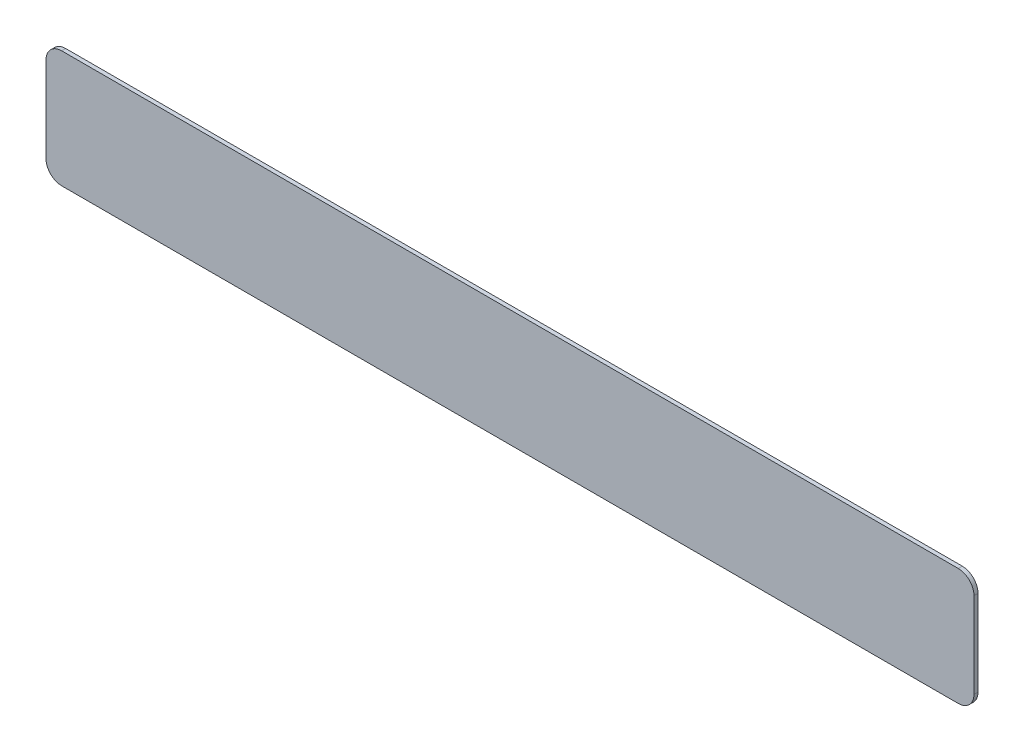
ISO-10303-21;
HEADER;
FILE_DESCRIPTION(('STEP AP214'),'2;1');
FILE_NAME('part.step','',(''),(''),'','','');
FILE_SCHEMA(('AUTOMOTIVE_DESIGN { 1 0 10303 214 1 1 1 1 }'));
ENDSEC;
DATA;
#1=APPLICATION_CONTEXT('core data for automotive mechanical design processes');
#2=APPLICATION_PROTOCOL_DEFINITION('international standard','automotive_design',2000,#1);
#3=PRODUCT_CONTEXT('',#1,'mechanical');
#4=PRODUCT('Part','Part','',(#3));
#5=PRODUCT_RELATED_PRODUCT_CATEGORY('part','',(#4));
#6=PRODUCT_DEFINITION_FORMATION('','',#4);
#7=PRODUCT_DEFINITION_CONTEXT('part definition',#1,'design');
#8=PRODUCT_DEFINITION('design','',#6,#7);
#9=PRODUCT_DEFINITION_SHAPE('','',#8);
#10=(LENGTH_UNIT() NAMED_UNIT(*) SI_UNIT(.MILLI.,.METRE.));
#11=(NAMED_UNIT(*) PLANE_ANGLE_UNIT() SI_UNIT($,.RADIAN.));
#12=(NAMED_UNIT(*) SI_UNIT($,.STERADIAN.) SOLID_ANGLE_UNIT());
#13=UNCERTAINTY_MEASURE_WITH_UNIT(LENGTH_MEASURE(1.E-05),#10,'distance_accuracy_value','');
#14=(GEOMETRIC_REPRESENTATION_CONTEXT(3) GLOBAL_UNCERTAINTY_ASSIGNED_CONTEXT((#13)) GLOBAL_UNIT_ASSIGNED_CONTEXT((#10,
#11,#12)) REPRESENTATION_CONTEXT('',''));
#15=CARTESIAN_POINT('',(0.,0.,0.));
#16=DIRECTION('',(0.,0.,1.));
#17=DIRECTION('',(1.,0.,0.));
#18=AXIS2_PLACEMENT_3D('',#15,#16,#17);
#19=CARTESIAN_POINT('',(-35.65,-3.4,0.32));
#20=DIRECTION('',(0.,0.,-1.));
#21=DIRECTION('',(-1.,0.,0.));
#22=AXIS2_PLACEMENT_3D('',#19,#20,#21);
#23=CYLINDRICAL_SURFACE('',#22,1.25);
#24=CARTESIAN_POINT('',(-35.65,-3.4,0.));
#25=DIRECTION('',(0.,0.,1.));
#26=DIRECTION('',(1.,0.,0.));
#27=AXIS2_PLACEMENT_3D('',#24,#25,#26);
#28=CIRCLE('',#27,1.25);
#29=CARTESIAN_POINT('',(-36.9,-3.4,0.));
#30=VERTEX_POINT('',#29);
#31=CARTESIAN_POINT('',(-35.65,-4.65,0.));
#32=VERTEX_POINT('',#31);
#33=EDGE_CURVE('E128',#30,#32,#28,.T.);
#34=ORIENTED_EDGE('',*,*,#33,.T.);
#35=DIRECTION('',(0.,0.,-1.));
#36=VECTOR('',#35,1.);
#37=CARTESIAN_POINT('',(-35.65,-4.65,0.32));
#38=LINE('',#37,#36);
#39=CARTESIAN_POINT('',(-35.65,-4.65,0.32));
#40=VERTEX_POINT('',#39);
#41=EDGE_CURVE('E11',#40,#32,#38,.T.);
#42=ORIENTED_EDGE('',*,*,#41,.F.);
#43=CARTESIAN_POINT('',(-35.65,-3.4,0.32));
#44=DIRECTION('',(0.,0.,1.));
#45=DIRECTION('',(1.,0.,0.));
#46=AXIS2_PLACEMENT_3D('',#43,#44,#45);
#47=CIRCLE('',#46,1.25);
#48=CARTESIAN_POINT('',(-36.9,-3.4,0.32));
#49=VERTEX_POINT('',#48);
#50=EDGE_CURVE('E142',#49,#40,#47,.T.);
#51=ORIENTED_EDGE('',*,*,#50,.F.);
#52=DIRECTION('',(0.,0.,-1.));
#53=VECTOR('',#52,1.);
#54=CARTESIAN_POINT('',(-36.9,-3.4,0.32));
#55=LINE('',#54,#53);
#56=EDGE_CURVE('E124',#49,#30,#55,.T.);
#57=ORIENTED_EDGE('',*,*,#56,.T.);
#58=EDGE_LOOP('',(#34,#42,#51,#57));
#59=FACE_BOUND('',#58,.T.);
#60=ADVANCED_FACE('F32',(#59),#23,.T.);
#61=CARTESIAN_POINT('',(-35.65,-4.65,0.32));
#62=DIRECTION('',(0.,1.,0.));
#63=DIRECTION('',(-1.,0.,0.));
#64=AXIS2_PLACEMENT_3D('',#61,#62,#63);
#65=PLANE('',#64);
#66=DIRECTION('',(1.,0.,0.));
#67=VECTOR('',#66,1.);
#68=CARTESIAN_POINT('',(-35.65,-4.65,0.));
#69=LINE('',#68,#67);
#70=CARTESIAN_POINT('',(35.65,-4.65,0.));
#71=VERTEX_POINT('',#70);
#72=EDGE_CURVE('E131',#32,#71,#69,.T.);
#73=ORIENTED_EDGE('',*,*,#72,.T.);
#74=DIRECTION('',(0.,0.,-1.));
#75=VECTOR('',#74,1.);
#76=CARTESIAN_POINT('',(35.65,-4.65,0.32));
#77=LINE('',#76,#75);
#78=CARTESIAN_POINT('',(35.65,-4.65,0.32));
#79=VERTEX_POINT('',#78);
#80=EDGE_CURVE('E40',#79,#71,#77,.T.);
#81=ORIENTED_EDGE('',*,*,#80,.F.);
#82=DIRECTION('',(1.,0.,0.));
#83=VECTOR('',#82,1.);
#84=CARTESIAN_POINT('',(-35.65,-4.65,0.32));
#85=LINE('',#84,#83);
#86=EDGE_CURVE('E91',#40,#79,#85,.T.);
#87=ORIENTED_EDGE('',*,*,#86,.F.);
#88=ORIENTED_EDGE('',*,*,#41,.T.);
#89=EDGE_LOOP('',(#73,#81,#87,#88));
#90=FACE_BOUND('',#89,.T.);
#91=ADVANCED_FACE('F177',(#90),#65,.F.);
#92=CARTESIAN_POINT('',(35.65,-3.4,0.32));
#93=DIRECTION('',(0.,0.,-1.));
#94=DIRECTION('',(-1.,0.,0.));
#95=AXIS2_PLACEMENT_3D('',#92,#93,#94);
#96=CYLINDRICAL_SURFACE('',#95,1.25);
#97=CARTESIAN_POINT('',(35.65,-3.4,0.));
#98=DIRECTION('',(0.,0.,1.));
#99=DIRECTION('',(1.,0.,0.));
#100=AXIS2_PLACEMENT_3D('',#97,#98,#99);
#101=CIRCLE('',#100,1.25);
#102=CARTESIAN_POINT('',(36.9,-3.4,0.));
#103=VERTEX_POINT('',#102);
#104=EDGE_CURVE('E133',#71,#103,#101,.T.);
#105=ORIENTED_EDGE('',*,*,#104,.T.);
#106=DIRECTION('',(0.,0.,-1.));
#107=VECTOR('',#106,1.);
#108=CARTESIAN_POINT('',(36.9,-3.4,0.32));
#109=LINE('',#108,#107);
#110=CARTESIAN_POINT('',(36.9,-3.4,0.32));
#111=VERTEX_POINT('',#110);
#112=EDGE_CURVE('E149',#111,#103,#109,.T.);
#113=ORIENTED_EDGE('',*,*,#112,.F.);
#114=CARTESIAN_POINT('',(35.65,-3.4,0.32));
#115=DIRECTION('',(0.,0.,1.));
#116=DIRECTION('',(1.,0.,0.));
#117=AXIS2_PLACEMENT_3D('',#114,#115,#116);
#118=CIRCLE('',#117,1.25);
#119=EDGE_CURVE('E157',#79,#111,#118,.T.);
#120=ORIENTED_EDGE('',*,*,#119,.F.);
#121=ORIENTED_EDGE('',*,*,#80,.T.);
#122=EDGE_LOOP('',(#105,#113,#120,#121));
#123=FACE_BOUND('',#122,.T.);
#124=ADVANCED_FACE('F155',(#123),#96,.T.);
#125=CARTESIAN_POINT('',(36.9,3.4,0.32));
#126=DIRECTION('',(-1.,0.,0.));
#127=DIRECTION('',(0.,-1.,0.));
#128=AXIS2_PLACEMENT_3D('',#125,#126,#127);
#129=PLANE('',#128);
#130=DIRECTION('',(0.,1.,0.));
#131=VECTOR('',#130,1.);
#132=CARTESIAN_POINT('',(36.9,3.4,0.));
#133=LINE('',#132,#131);
#134=CARTESIAN_POINT('',(36.9,3.4,0.));
#135=VERTEX_POINT('',#134);
#136=EDGE_CURVE('E135',#103,#135,#133,.T.);
#137=ORIENTED_EDGE('',*,*,#136,.T.);
#138=DIRECTION('',(0.,0.,-1.));
#139=VECTOR('',#138,1.);
#140=CARTESIAN_POINT('',(36.9,3.4,0.32));
#141=LINE('',#140,#139);
#142=CARTESIAN_POINT('',(36.9,3.4,0.32));
#143=VERTEX_POINT('',#142);
#144=EDGE_CURVE('E146',#143,#135,#141,.T.);
#145=ORIENTED_EDGE('',*,*,#144,.F.);
#146=DIRECTION('',(0.,1.,0.));
#147=VECTOR('',#146,1.);
#148=CARTESIAN_POINT('',(36.9,3.4,0.32));
#149=LINE('',#148,#147);
#150=EDGE_CURVE('E169',#111,#143,#149,.T.);
#151=ORIENTED_EDGE('',*,*,#150,.F.);
#152=ORIENTED_EDGE('',*,*,#112,.T.);
#153=EDGE_LOOP('',(#137,#145,#151,#152));
#154=FACE_BOUND('',#153,.T.);
#155=ADVANCED_FACE('F165',(#154),#129,.F.);
#156=CARTESIAN_POINT('',(35.65,3.4,0.32));
#157=DIRECTION('',(0.,0.,-1.));
#158=DIRECTION('',(-1.,0.,0.));
#159=AXIS2_PLACEMENT_3D('',#156,#157,#158);
#160=CYLINDRICAL_SURFACE('',#159,1.24999999999999);
#161=CARTESIAN_POINT('',(35.65,3.4,0.));
#162=DIRECTION('',(0.,0.,1.));
#163=DIRECTION('',(-1.,0.,0.));
#164=AXIS2_PLACEMENT_3D('',#161,#162,#163);
#165=CIRCLE('',#164,1.24999999999999);
#166=CARTESIAN_POINT('',(35.65,4.65,0.));
#167=VERTEX_POINT('',#166);
#168=EDGE_CURVE('E137',#135,#167,#165,.T.);
#169=ORIENTED_EDGE('',*,*,#168,.T.);
#170=DIRECTION('',(0.,0.,-1.));
#171=VECTOR('',#170,1.);
#172=CARTESIAN_POINT('',(35.65,4.65,0.32));
#173=LINE('',#172,#171);
#174=CARTESIAN_POINT('',(35.65,4.65,0.32));
#175=VERTEX_POINT('',#174);
#176=EDGE_CURVE('E119',#175,#167,#173,.T.);
#177=ORIENTED_EDGE('',*,*,#176,.F.);
#178=CARTESIAN_POINT('',(35.65,3.4,0.32));
#179=DIRECTION('',(0.,0.,1.));
#180=DIRECTION('',(-1.,0.,0.));
#181=AXIS2_PLACEMENT_3D('',#178,#179,#180);
#182=CIRCLE('',#181,1.24999999999999);
#183=EDGE_CURVE('E110',#143,#175,#182,.T.);
#184=ORIENTED_EDGE('',*,*,#183,.F.);
#185=ORIENTED_EDGE('',*,*,#144,.T.);
#186=EDGE_LOOP('',(#169,#177,#184,#185));
#187=FACE_BOUND('',#186,.T.);
#188=ADVANCED_FACE('F168',(#187),#160,.T.);
#189=CARTESIAN_POINT('',(-35.65,4.65,0.32));
#190=DIRECTION('',(0.,-1.,0.));
#191=DIRECTION('',(1.,0.,0.));
#192=AXIS2_PLACEMENT_3D('',#189,#190,#191);
#193=PLANE('',#192);
#194=DIRECTION('',(-1.,0.,0.));
#195=VECTOR('',#194,1.);
#196=CARTESIAN_POINT('',(-35.65,4.65,0.));
#197=LINE('',#196,#195);
#198=CARTESIAN_POINT('',(-35.65,4.65,0.));
#199=VERTEX_POINT('',#198);
#200=EDGE_CURVE('E118',#167,#199,#197,.T.);
#201=ORIENTED_EDGE('',*,*,#200,.T.);
#202=DIRECTION('',(0.,0.,-1.));
#203=VECTOR('',#202,1.);
#204=CARTESIAN_POINT('',(-35.65,4.65,0.32));
#205=LINE('',#204,#203);
#206=CARTESIAN_POINT('',(-35.65,4.65,0.32));
#207=VERTEX_POINT('',#206);
#208=EDGE_CURVE('E115',#207,#199,#205,.T.);
#209=ORIENTED_EDGE('',*,*,#208,.F.);
#210=DIRECTION('',(-1.,0.,0.));
#211=VECTOR('',#210,1.);
#212=CARTESIAN_POINT('',(-35.65,4.65,0.32));
#213=LINE('',#212,#211);
#214=EDGE_CURVE('E104',#175,#207,#213,.T.);
#215=ORIENTED_EDGE('',*,*,#214,.F.);
#216=ORIENTED_EDGE('',*,*,#176,.T.);
#217=EDGE_LOOP('',(#201,#209,#215,#216));
#218=FACE_BOUND('',#217,.T.);
#219=ADVANCED_FACE('F116',(#218),#193,.F.);
#220=CARTESIAN_POINT('',(-35.65,3.4,0.32));
#221=DIRECTION('',(0.,0.,-1.));
#222=DIRECTION('',(-1.,0.,0.));
#223=AXIS2_PLACEMENT_3D('',#220,#221,#222);
#224=CYLINDRICAL_SURFACE('',#223,1.25);
#225=CARTESIAN_POINT('',(-35.65,3.4,0.));
#226=DIRECTION('',(0.,0.,1.));
#227=DIRECTION('',(1.,0.,0.));
#228=AXIS2_PLACEMENT_3D('',#225,#226,#227);
#229=CIRCLE('',#228,1.25);
#230=CARTESIAN_POINT('',(-36.9,3.4,0.));
#231=VERTEX_POINT('',#230);
#232=EDGE_CURVE('E77',#199,#231,#229,.T.);
#233=ORIENTED_EDGE('',*,*,#232,.T.);
#234=DIRECTION('',(0.,0.,-1.));
#235=VECTOR('',#234,1.);
#236=CARTESIAN_POINT('',(-36.9,3.4,0.32));
#237=LINE('',#236,#235);
#238=CARTESIAN_POINT('',(-36.9,3.4,0.32));
#239=VERTEX_POINT('',#238);
#240=EDGE_CURVE('E120',#239,#231,#237,.T.);
#241=ORIENTED_EDGE('',*,*,#240,.F.);
#242=CARTESIAN_POINT('',(-35.65,3.4,0.32));
#243=DIRECTION('',(0.,0.,1.));
#244=DIRECTION('',(1.,0.,0.));
#245=AXIS2_PLACEMENT_3D('',#242,#243,#244);
#246=CIRCLE('',#245,1.25);
#247=EDGE_CURVE('E108',#207,#239,#246,.T.);
#248=ORIENTED_EDGE('',*,*,#247,.F.);
#249=ORIENTED_EDGE('',*,*,#208,.T.);
#250=EDGE_LOOP('',(#233,#241,#248,#249));
#251=FACE_BOUND('',#250,.T.);
#252=ADVANCED_FACE('F122',(#251),#224,.T.);
#253=CARTESIAN_POINT('',(-36.9,3.4,0.32));
#254=DIRECTION('',(1.,0.,0.));
#255=DIRECTION('',(0.,0.,-1.));
#256=AXIS2_PLACEMENT_3D('',#253,#254,#255);
#257=PLANE('',#256);
#258=DIRECTION('',(0.,-1.,0.));
#259=VECTOR('',#258,1.);
#260=CARTESIAN_POINT('',(-36.9,3.4,0.));
#261=LINE('',#260,#259);
#262=EDGE_CURVE('E83',#231,#30,#261,.T.);
#263=ORIENTED_EDGE('',*,*,#262,.T.);
#264=ORIENTED_EDGE('',*,*,#56,.F.);
#265=DIRECTION('',(0.,-1.,0.));
#266=VECTOR('',#265,1.);
#267=CARTESIAN_POINT('',(-36.9,3.4,0.32));
#268=LINE('',#267,#266);
#269=EDGE_CURVE('E48',#239,#49,#268,.T.);
#270=ORIENTED_EDGE('',*,*,#269,.F.);
#271=ORIENTED_EDGE('',*,*,#240,.T.);
#272=EDGE_LOOP('',(#263,#264,#270,#271));
#273=FACE_BOUND('',#272,.T.);
#274=ADVANCED_FACE('F193',(#273),#257,.F.);
#275=CARTESIAN_POINT('',(-35.65,-3.4,0.32));
#276=DIRECTION('',(0.,0.,1.));
#277=DIRECTION('',(1.,0.,0.));
#278=AXIS2_PLACEMENT_3D('',#275,#276,#277);
#279=PLANE('',#278);
#280=ORIENTED_EDGE('',*,*,#50,.T.);
#281=ORIENTED_EDGE('',*,*,#86,.T.);
#282=ORIENTED_EDGE('',*,*,#119,.T.);
#283=ORIENTED_EDGE('',*,*,#150,.T.);
#284=ORIENTED_EDGE('',*,*,#183,.T.);
#285=ORIENTED_EDGE('',*,*,#214,.T.);
#286=ORIENTED_EDGE('',*,*,#247,.T.);
#287=ORIENTED_EDGE('',*,*,#269,.T.);
#288=EDGE_LOOP('',(#280,#281,#282,#283,#284,#285,#286,#287));
#289=FACE_BOUND('',#288,.T.);
#290=ADVANCED_FACE('F106',(#289),#279,.T.);
#291=CARTESIAN_POINT('',(-35.65,-3.4,0.));
#292=DIRECTION('',(0.,0.,1.));
#293=DIRECTION('',(1.,0.,0.));
#294=AXIS2_PLACEMENT_3D('',#291,#292,#293);
#295=PLANE('',#294);
#296=ORIENTED_EDGE('',*,*,#33,.F.);
#297=ORIENTED_EDGE('',*,*,#262,.F.);
#298=ORIENTED_EDGE('',*,*,#232,.F.);
#299=ORIENTED_EDGE('',*,*,#200,.F.);
#300=ORIENTED_EDGE('',*,*,#168,.F.);
#301=ORIENTED_EDGE('',*,*,#136,.F.);
#302=ORIENTED_EDGE('',*,*,#104,.F.);
#303=ORIENTED_EDGE('',*,*,#72,.F.);
#304=EDGE_LOOP('',(#296,#297,#298,#299,#300,#301,#302,#303));
#305=FACE_BOUND('',#304,.T.);
#306=ADVANCED_FACE('F161',(#305),#295,.F.);
#307=CLOSED_SHELL('',(#60,#91,#124,#155,#188,#219,#252,#274,#290,#306));
#308=MANIFOLD_SOLID_BREP('B2',#307);
#309=ADVANCED_BREP_SHAPE_REPRESENTATION('',(#18,#308),#14);
#310=SHAPE_DEFINITION_REPRESENTATION(#9,#309);
ENDSEC;
END-ISO-10303-21;
